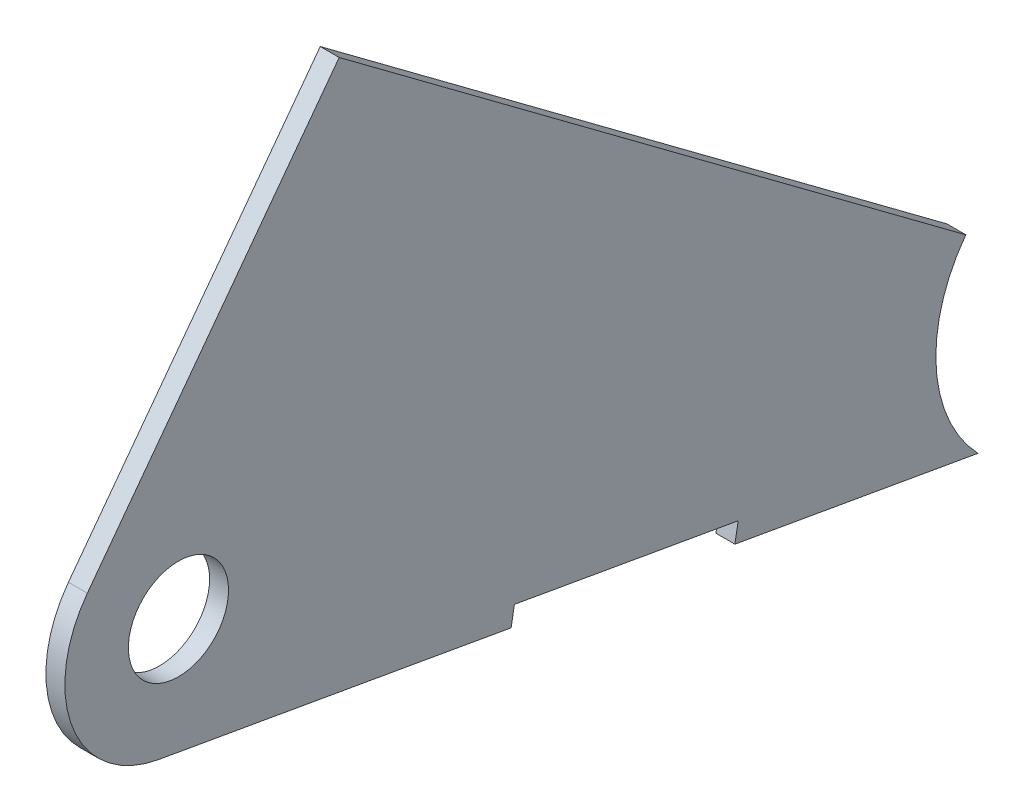
ISO-10303-21;
HEADER;
FILE_DESCRIPTION(('STEP AP214'),'2;1');
FILE_NAME('part.step','',(''),(''),'','','');
FILE_SCHEMA(('AUTOMOTIVE_DESIGN { 1 0 10303 214 1 1 1 1 }'));
ENDSEC;
DATA;
#1=APPLICATION_CONTEXT('core data for automotive mechanical design processes');
#2=APPLICATION_PROTOCOL_DEFINITION('international standard','automotive_design',2000,#1);
#3=PRODUCT_CONTEXT('',#1,'mechanical');
#4=PRODUCT('Part','Part','',(#3));
#5=PRODUCT_RELATED_PRODUCT_CATEGORY('part','',(#4));
#6=PRODUCT_DEFINITION_FORMATION('','',#4);
#7=PRODUCT_DEFINITION_CONTEXT('part definition',#1,'design');
#8=PRODUCT_DEFINITION('design','',#6,#7);
#9=PRODUCT_DEFINITION_SHAPE('','',#8);
#10=(LENGTH_UNIT() NAMED_UNIT(*) SI_UNIT(.MILLI.,.METRE.));
#11=(NAMED_UNIT(*) PLANE_ANGLE_UNIT() SI_UNIT($,.RADIAN.));
#12=(NAMED_UNIT(*) SI_UNIT($,.STERADIAN.) SOLID_ANGLE_UNIT());
#13=UNCERTAINTY_MEASURE_WITH_UNIT(LENGTH_MEASURE(1.E-05),#10,'distance_accuracy_value','');
#14=(GEOMETRIC_REPRESENTATION_CONTEXT(3) GLOBAL_UNCERTAINTY_ASSIGNED_CONTEXT((#13)) GLOBAL_UNIT_ASSIGNED_CONTEXT((#10,
#11,#12)) REPRESENTATION_CONTEXT('',''));
#15=CARTESIAN_POINT('',(0.,0.,0.));
#16=DIRECTION('',(0.,0.,1.));
#17=DIRECTION('',(1.,0.,0.));
#18=AXIS2_PLACEMENT_3D('',#15,#16,#17);
#19=CARTESIAN_POINT('',(1.5875,5.69069410272503,7.63816899716225));
#20=DIRECTION('',(0.,0.597448199761158,0.801907506263753));
#21=DIRECTION('',(0.,-0.801907506263753,0.597448199761158));
#22=AXIS2_PLACEMENT_3D('',#19,#20,#21);
#23=PLANE('',#22);
#24=DIRECTION('',(0.,0.801907506263753,-0.597448199761158));
#25=VECTOR('',#24,1.);
#26=CARTESIAN_POINT('',(0.,5.69069410272503,7.63816899716225));
#27=LINE('',#26,#25);
#28=CARTESIAN_POINT('',(0.,5.69069410272503,7.63816899716225));
#29=VERTEX_POINT('',#28);
#30=CARTESIAN_POINT('',(0.,34.0311699000864,-13.4764434902524));
#31=VERTEX_POINT('',#30);
#32=EDGE_CURVE('E135',#29,#31,#27,.T.);
#33=ORIENTED_EDGE('',*,*,#32,.F.);
#34=DIRECTION('',(-1.,0.,0.));
#35=VECTOR('',#34,1.);
#36=CARTESIAN_POINT('',(1.5875,5.69069410272503,7.63816899716225));
#37=LINE('',#36,#35);
#38=CARTESIAN_POINT('',(1.5875,5.69069410272503,7.63816899716225));
#39=VERTEX_POINT('',#38);
#40=EDGE_CURVE('E11',#39,#29,#37,.T.);
#41=ORIENTED_EDGE('',*,*,#40,.F.);
#42=DIRECTION('',(0.,0.801907506263753,-0.597448199761158));
#43=VECTOR('',#42,1.);
#44=CARTESIAN_POINT('',(1.5875,5.69069410272503,7.63816899716225));
#45=LINE('',#44,#43);
#46=CARTESIAN_POINT('',(1.5875,34.0311699000864,-13.4764434902524));
#47=VERTEX_POINT('',#46);
#48=EDGE_CURVE('E157',#39,#47,#45,.T.);
#49=ORIENTED_EDGE('',*,*,#48,.T.);
#50=DIRECTION('',(-1.,0.,0.));
#51=VECTOR('',#50,1.);
#52=CARTESIAN_POINT('',(1.5875,34.0311699000864,-13.4764434902524));
#53=LINE('',#52,#51);
#54=EDGE_CURVE('E50',#47,#31,#53,.T.);
#55=ORIENTED_EDGE('',*,*,#54,.T.);
#56=EDGE_LOOP('',(#33,#41,#49,#55));
#57=FACE_BOUND('',#56,.T.);
#58=ADVANCED_FACE('F34',(#57),#23,.T.);
#59=CARTESIAN_POINT('',(1.5875,0.,0.));
#60=DIRECTION('',(-1.,0.,0.));
#61=DIRECTION('',(0.,0.,1.));
#62=AXIS2_PLACEMENT_3D('',#59,#60,#61);
#63=CYLINDRICAL_SURFACE('',#62,9.525);
#64=CARTESIAN_POINT('',(0.,0.,0.));
#65=DIRECTION('',(1.,0.,0.));
#66=DIRECTION('',(0.,0.,-1.));
#67=AXIS2_PLACEMENT_3D('',#64,#65,#66);
#68=CIRCLE('',#67,9.525);
#69=CARTESIAN_POINT('',(0.,-9.38029384744128,1.65399889227755));
#70=VERTEX_POINT('',#69);
#71=EDGE_CURVE('E137',#29,#70,#68,.T.);
#72=ORIENTED_EDGE('',*,*,#71,.T.);
#73=DIRECTION('',(-1.,0.,0.));
#74=VECTOR('',#73,1.);
#75=CARTESIAN_POINT('',(1.5875,-9.38029384744128,1.65399889227755));
#76=LINE('',#75,#74);
#77=CARTESIAN_POINT('',(1.5875,-9.38029384744128,1.65399889227755));
#78=VERTEX_POINT('',#77);
#79=EDGE_CURVE('E42',#78,#70,#76,.T.);
#80=ORIENTED_EDGE('',*,*,#79,.F.);
#81=CARTESIAN_POINT('',(1.5875,0.,0.));
#82=DIRECTION('',(1.,0.,0.));
#83=DIRECTION('',(0.,0.,-1.));
#84=AXIS2_PLACEMENT_3D('',#81,#82,#83);
#85=CIRCLE('',#84,9.525);
#86=EDGE_CURVE('E192',#39,#78,#85,.T.);
#87=ORIENTED_EDGE('',*,*,#86,.F.);
#88=ORIENTED_EDGE('',*,*,#40,.T.);
#89=EDGE_LOOP('',(#72,#80,#87,#88));
#90=FACE_BOUND('',#89,.T.);
#91=ADVANCED_FACE('F175',(#90),#63,.T.);
#92=CARTESIAN_POINT('',(1.5875,-9.38029384744128,1.65399889227755));
#93=DIRECTION('',(0.,-0.984807753012207,0.173648177666934));
#94=DIRECTION('',(0.,-0.173648177666934,-0.984807753012207));
#95=AXIS2_PLACEMENT_3D('',#92,#93,#94);
#96=PLANE('',#95);
#97=DIRECTION('',(0.,0.173648177666934,0.984807753012208));
#98=VECTOR('',#97,1.);
#99=CARTESIAN_POINT('',(0.,-9.38029384744128,1.65399889227755));
#100=LINE('',#99,#98);
#101=CARTESIAN_POINT('',(0.,-14.5901752355416,-27.89270670642));
#102=VERTEX_POINT('',#101);
#103=EDGE_CURVE('E141',#102,#70,#100,.T.);
#104=ORIENTED_EDGE('',*,*,#103,.F.);
#105=DIRECTION('',(-1.,0.,0.));
#106=VECTOR('',#105,1.);
#107=CARTESIAN_POINT('',(1.5875,-14.5901752355416,-27.89270670642));
#108=LINE('',#107,#106);
#109=CARTESIAN_POINT('',(1.5875,-14.5901752355416,-27.89270670642));
#110=VERTEX_POINT('',#109);
#111=EDGE_CURVE('E166',#110,#102,#108,.T.);
#112=ORIENTED_EDGE('',*,*,#111,.F.);
#113=DIRECTION('',(0.,0.173648177666934,0.984807753012208));
#114=VECTOR('',#113,1.);
#115=CARTESIAN_POINT('',(1.5875,-9.38029384744128,1.65399889227755));
#116=LINE('',#115,#114);
#117=EDGE_CURVE('E127',#110,#78,#116,.T.);
#118=ORIENTED_EDGE('',*,*,#117,.T.);
#119=ORIENTED_EDGE('',*,*,#79,.T.);
#120=EDGE_LOOP('',(#104,#112,#118,#119));
#121=FACE_BOUND('',#120,.T.);
#122=ADVANCED_FACE('F171',(#121),#96,.T.);
#123=CARTESIAN_POINT('',(1.5875,-5.20988138810042,-29.5467055986975));
#124=DIRECTION('',(0.,0.173648177666936,0.984807753012207));
#125=DIRECTION('',(0.,-0.984807753012207,0.173648177666936));
#126=AXIS2_PLACEMENT_3D('',#123,#124,#125);
#127=PLANE('',#126);
#128=DIRECTION('',(0.,0.984807753012207,-0.173648177666936));
#129=VECTOR('',#128,1.);
#130=CARTESIAN_POINT('',(0.,-5.20988138810042,-29.5467055986975));
#131=LINE('',#130,#129);
#132=CARTESIAN_POINT('',(0.,-13.0267929276348,-28.1683731884662));
#133=VERTEX_POINT('',#132);
#134=EDGE_CURVE('E144',#102,#133,#131,.T.);
#135=ORIENTED_EDGE('',*,*,#134,.T.);
#136=DIRECTION('',(-1.,0.,0.));
#137=VECTOR('',#136,1.);
#138=CARTESIAN_POINT('',(1.5875,-13.0267929276348,-28.1683731884662));
#139=LINE('',#138,#137);
#140=CARTESIAN_POINT('',(1.5875,-13.0267929276348,-28.1683731884662));
#141=VERTEX_POINT('',#140);
#142=EDGE_CURVE('E163',#141,#133,#139,.T.);
#143=ORIENTED_EDGE('',*,*,#142,.F.);
#144=DIRECTION('',(0.,0.984807753012207,-0.173648177666936));
#145=VECTOR('',#144,1.);
#146=CARTESIAN_POINT('',(1.5875,-5.20988138810042,-29.5467055986975));
#147=LINE('',#146,#145);
#148=EDGE_CURVE('E189',#110,#141,#147,.T.);
#149=ORIENTED_EDGE('',*,*,#148,.F.);
#150=ORIENTED_EDGE('',*,*,#111,.T.);
#151=EDGE_LOOP('',(#135,#143,#149,#150));
#152=FACE_BOUND('',#151,.T.);
#153=ADVANCED_FACE('F182',(#152),#127,.F.);
#154=CARTESIAN_POINT('',(1.5875,-7.81691153953441,1.37833241023129));
#155=DIRECTION('',(0.,0.984807753012207,-0.173648177666934));
#156=DIRECTION('',(0.,0.173648177666934,0.984807753012207));
#157=AXIS2_PLACEMENT_3D('',#154,#155,#156);
#158=PLANE('',#157);
#159=DIRECTION('',(0.,-0.173648177666934,-0.984807753012208));
#160=VECTOR('',#159,1.);
#161=CARTESIAN_POINT('',(0.,-7.81691153953441,1.37833241023129));
#162=LINE('',#161,#160);
#163=CARTESIAN_POINT('',(0.,-16.3347907121898,-46.9289608833488));
#164=VERTEX_POINT('',#163);
#165=EDGE_CURVE('E146',#133,#164,#162,.T.);
#166=ORIENTED_EDGE('',*,*,#165,.T.);
#167=DIRECTION('',(-1.,0.,0.));
#168=VECTOR('',#167,1.);
#169=CARTESIAN_POINT('',(1.5875,-16.3347907121898,-46.9289608833488));
#170=LINE('',#169,#168);
#171=CARTESIAN_POINT('',(1.5875,-16.3347907121898,-46.9289608833488));
#172=VERTEX_POINT('',#171);
#173=EDGE_CURVE('E161',#172,#164,#170,.T.);
#174=ORIENTED_EDGE('',*,*,#173,.F.);
#175=DIRECTION('',(0.,-0.173648177666934,-0.984807753012208));
#176=VECTOR('',#175,1.);
#177=CARTESIAN_POINT('',(1.5875,-7.81691153953441,1.37833241023129));
#178=LINE('',#177,#176);
#179=EDGE_CURVE('E188',#141,#172,#178,.T.);
#180=ORIENTED_EDGE('',*,*,#179,.F.);
#181=ORIENTED_EDGE('',*,*,#142,.T.);
#182=EDGE_LOOP('',(#166,#174,#180,#181));
#183=FACE_BOUND('',#182,.T.);
#184=ADVANCED_FACE('F186',(#183),#158,.F.);
#185=CARTESIAN_POINT('',(1.5875,-8.51787917265523,-48.3072932935801));
#186=DIRECTION('',(0.,0.17364817766693,0.984807753012208));
#187=DIRECTION('',(0.,-0.984807753012208,0.17364817766693));
#188=AXIS2_PLACEMENT_3D('',#185,#186,#187);
#189=PLANE('',#188);
#190=DIRECTION('',(0.,0.984807753012208,-0.17364817766693));
#191=VECTOR('',#190,1.);
#192=CARTESIAN_POINT('',(0.,-8.51787917265523,-48.3072932935801));
#193=LINE('',#192,#191);
#194=CARTESIAN_POINT('',(0.,-17.8981730200967,-46.6532944013025));
#195=VERTEX_POINT('',#194);
#196=EDGE_CURVE('E149',#195,#164,#193,.T.);
#197=ORIENTED_EDGE('',*,*,#196,.F.);
#198=DIRECTION('',(-1.,0.,0.));
#199=VECTOR('',#198,1.);
#200=CARTESIAN_POINT('',(1.5875,-17.8981730200967,-46.6532944013025));
#201=LINE('',#200,#199);
#202=CARTESIAN_POINT('',(1.5875,-17.8981730200967,-46.6532944013025));
#203=VERTEX_POINT('',#202);
#204=EDGE_CURVE('E115',#203,#195,#201,.T.);
#205=ORIENTED_EDGE('',*,*,#204,.F.);
#206=DIRECTION('',(0.,0.984807753012208,-0.17364817766693));
#207=VECTOR('',#206,1.);
#208=CARTESIAN_POINT('',(1.5875,-8.51787917265523,-48.3072932935801));
#209=LINE('',#208,#207);
#210=EDGE_CURVE('E125',#203,#172,#209,.T.);
#211=ORIENTED_EDGE('',*,*,#210,.T.);
#212=ORIENTED_EDGE('',*,*,#173,.T.);
#213=EDGE_LOOP('',(#197,#205,#211,#212));
#214=FACE_BOUND('',#213,.T.);
#215=ADVANCED_FACE('F220',(#214),#189,.T.);
#216=CARTESIAN_POINT('',(0.,-21.4920963514083,-67.0354464512693));
#217=VERTEX_POINT('',#216);
#218=EDGE_CURVE('E111',#217,#195,#100,.T.);
#219=ORIENTED_EDGE('',*,*,#218,.F.);
#220=DIRECTION('',(-1.,0.,0.));
#221=VECTOR('',#220,1.);
#222=CARTESIAN_POINT('',(1.5875,-21.4920963514083,-67.0354464512693));
#223=LINE('',#222,#221);
#224=CARTESIAN_POINT('',(1.5875,-21.4920963514083,-67.0354464512693));
#225=VERTEX_POINT('',#224);
#226=EDGE_CURVE('E106',#225,#217,#223,.T.);
#227=ORIENTED_EDGE('',*,*,#226,.F.);
#228=EDGE_CURVE('E109',#225,#203,#116,.T.);
#229=ORIENTED_EDGE('',*,*,#228,.T.);
#230=ORIENTED_EDGE('',*,*,#204,.T.);
#231=EDGE_LOOP('',(#219,#227,#229,#230));
#232=FACE_BOUND('',#231,.T.);
#233=ADVANCED_FACE('F108',(#232),#96,.T.);
#234=CARTESIAN_POINT('',(1.5875,-12.7,-76.2));
#235=DIRECTION('',(-1.,0.,0.));
#236=DIRECTION('',(0.,0.,1.));
#237=AXIS2_PLACEMENT_3D('',#234,#235,#236);
#238=CYLINDRICAL_SURFACE('',#237,12.7);
#239=CARTESIAN_POINT('',(0.,-12.7,-76.2));
#240=DIRECTION('',(1.,0.,0.));
#241=DIRECTION('',(0.,0.,-1.));
#242=AXIS2_PLACEMENT_3D('',#239,#240,#241);
#243=CIRCLE('',#242,12.7);
#244=CARTESIAN_POINT('',(0.,-5.11240786303331,-66.0157746704503));
#245=VERTEX_POINT('',#244);
#246=EDGE_CURVE('E152',#245,#217,#243,.T.);
#247=ORIENTED_EDGE('',*,*,#246,.F.);
#248=DIRECTION('',(-1.,0.,0.));
#249=VECTOR('',#248,1.);
#250=CARTESIAN_POINT('',(1.5875,-5.11240786303331,-66.0157746704503));
#251=LINE('',#250,#249);
#252=CARTESIAN_POINT('',(1.5875,-5.11240786303331,-66.0157746704503));
#253=VERTEX_POINT('',#252);
#254=EDGE_CURVE('E78',#253,#245,#251,.T.);
#255=ORIENTED_EDGE('',*,*,#254,.F.);
#256=CARTESIAN_POINT('',(1.5875,-12.7,-76.2));
#257=DIRECTION('',(1.,0.,0.));
#258=DIRECTION('',(0.,0.,-1.));
#259=AXIS2_PLACEMENT_3D('',#256,#257,#258);
#260=CIRCLE('',#259,12.7);
#261=EDGE_CURVE('E123',#253,#225,#260,.T.);
#262=ORIENTED_EDGE('',*,*,#261,.T.);
#263=ORIENTED_EDGE('',*,*,#226,.T.);
#264=EDGE_LOOP('',(#247,#255,#262,#263));
#265=FACE_BOUND('',#264,.T.);
#266=ADVANCED_FACE('F128',(#265),#238,.F.);
#267=CARTESIAN_POINT('',(1.5875,28.3404757973613,-21.1146124874147));
#268=DIRECTION('',(0.,0.801907506263753,-0.597448199761158));
#269=DIRECTION('',(0.,0.597448199761158,0.801907506263753));
#270=AXIS2_PLACEMENT_3D('',#267,#268,#269);
#271=PLANE('',#270);
#272=DIRECTION('',(0.,-0.597448199761158,-0.801907506263753));
#273=VECTOR('',#272,1.);
#274=CARTESIAN_POINT('',(0.,28.3404757973613,-21.1146124874147));
#275=LINE('',#274,#273);
#276=EDGE_CURVE('E154',#31,#245,#275,.T.);
#277=ORIENTED_EDGE('',*,*,#276,.F.);
#278=ORIENTED_EDGE('',*,*,#54,.F.);
#279=DIRECTION('',(0.,-0.597448199761158,-0.801907506263753));
#280=VECTOR('',#279,1.);
#281=CARTESIAN_POINT('',(1.5875,28.3404757973613,-21.1146124874147));
#282=LINE('',#281,#280);
#283=EDGE_CURVE('E129',#47,#253,#282,.T.);
#284=ORIENTED_EDGE('',*,*,#283,.T.);
#285=ORIENTED_EDGE('',*,*,#254,.T.);
#286=EDGE_LOOP('',(#277,#278,#284,#285));
#287=FACE_BOUND('',#286,.T.);
#288=ADVANCED_FACE('F204',(#287),#271,.T.);
#289=CARTESIAN_POINT('',(1.5875,0.,0.));
#290=DIRECTION('',(1.,0.,0.));
#291=DIRECTION('',(0.,0.,-1.));
#292=AXIS2_PLACEMENT_3D('',#289,#290,#291);
#293=PLANE('',#292);
#294=CARTESIAN_POINT('',(1.5875,0.,0.));
#295=DIRECTION('',(1.,0.,0.));
#296=DIRECTION('',(0.,0.,-1.));
#297=AXIS2_PLACEMENT_3D('',#294,#295,#296);
#298=CIRCLE('',#297,4.19999999999999);
#299=CARTESIAN_POINT('',(1.5875,0.,-4.19999999999999));
#300=VERTEX_POINT('',#299);
#301=EDGE_CURVE('E197',#300,#300,#298,.T.);
#302=ORIENTED_EDGE('',*,*,#301,.F.);
#303=EDGE_LOOP('',(#302));
#304=FACE_BOUND('',#303,.T.);
#305=ORIENTED_EDGE('',*,*,#48,.F.);
#306=ORIENTED_EDGE('',*,*,#86,.T.);
#307=ORIENTED_EDGE('',*,*,#117,.F.);
#308=ORIENTED_EDGE('',*,*,#148,.T.);
#309=ORIENTED_EDGE('',*,*,#179,.T.);
#310=ORIENTED_EDGE('',*,*,#210,.F.);
#311=ORIENTED_EDGE('',*,*,#228,.F.);
#312=ORIENTED_EDGE('',*,*,#261,.F.);
#313=ORIENTED_EDGE('',*,*,#283,.F.);
#314=EDGE_LOOP('',(#305,#306,#307,#308,#309,#310,#311,#312,#313));
#315=FACE_BOUND('',#314,.T.);
#316=ADVANCED_FACE('F121',(#304,#315),#293,.T.);
#317=CARTESIAN_POINT('',(0.,0.,0.));
#318=DIRECTION('',(1.,0.,0.));
#319=DIRECTION('',(0.,0.,-1.));
#320=AXIS2_PLACEMENT_3D('',#317,#318,#319);
#321=PLANE('',#320);
#322=CARTESIAN_POINT('',(0.,0.,0.));
#323=DIRECTION('',(1.,0.,0.));
#324=DIRECTION('',(0.,0.,-1.));
#325=AXIS2_PLACEMENT_3D('',#322,#323,#324);
#326=CIRCLE('',#325,4.2);
#327=CARTESIAN_POINT('',(0.,0.,-4.2));
#328=VERTEX_POINT('',#327);
#329=EDGE_CURVE('E138',#328,#328,#326,.T.);
#330=ORIENTED_EDGE('',*,*,#329,.T.);
#331=EDGE_LOOP('',(#330));
#332=FACE_BOUND('',#331,.T.);
#333=ORIENTED_EDGE('',*,*,#32,.T.);
#334=ORIENTED_EDGE('',*,*,#276,.T.);
#335=ORIENTED_EDGE('',*,*,#246,.T.);
#336=ORIENTED_EDGE('',*,*,#218,.T.);
#337=ORIENTED_EDGE('',*,*,#196,.T.);
#338=ORIENTED_EDGE('',*,*,#165,.F.);
#339=ORIENTED_EDGE('',*,*,#134,.F.);
#340=ORIENTED_EDGE('',*,*,#103,.T.);
#341=ORIENTED_EDGE('',*,*,#71,.F.);
#342=EDGE_LOOP('',(#333,#334,#335,#336,#337,#338,#339,#340,#341));
#343=FACE_BOUND('',#342,.T.);
#344=ADVANCED_FACE('F178',(#332,#343),#321,.F.);
#345=CARTESIAN_POINT('',(1.5875,0.,0.));
#346=DIRECTION('',(1.,0.,0.));
#347=DIRECTION('',(0.,0.,-1.));
#348=AXIS2_PLACEMENT_3D('',#345,#346,#347);
#349=CYLINDRICAL_SURFACE('',#348,4.19999999999999);
#350=ORIENTED_EDGE('',*,*,#329,.F.);
#351=EDGE_LOOP('',(#350));
#352=FACE_BOUND('',#351,.T.);
#353=ORIENTED_EDGE('',*,*,#301,.T.);
#354=EDGE_LOOP('',(#353));
#355=FACE_BOUND('',#354,.T.);
#356=ADVANCED_FACE('F201',(#352,#355),#349,.F.);
#357=CLOSED_SHELL('',(#58,#91,#122,#153,#184,#215,#233,#266,#288,#316,#344,#356));
#358=MANIFOLD_SOLID_BREP('B2',#357);
#359=ADVANCED_BREP_SHAPE_REPRESENTATION('',(#18,#358),#14);
#360=SHAPE_DEFINITION_REPRESENTATION(#9,#359);
ENDSEC;
END-ISO-10303-21;
